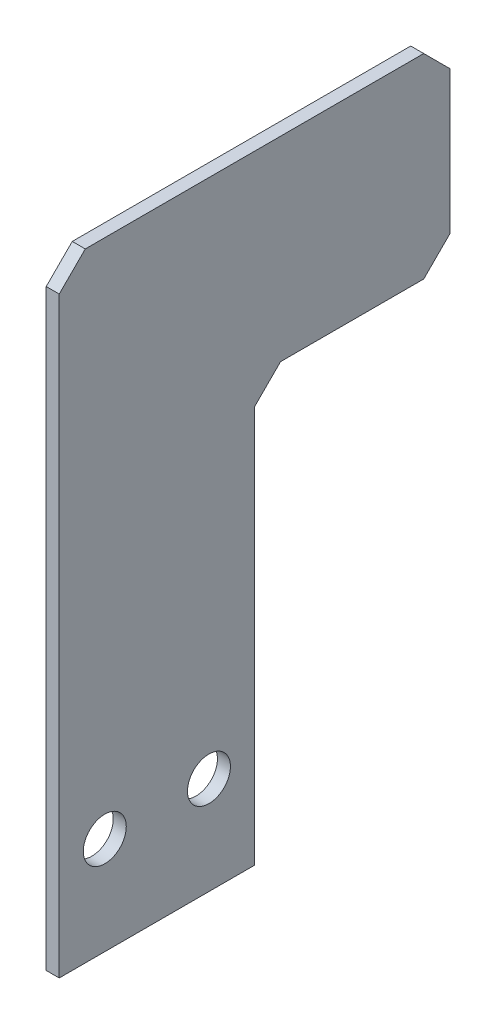
ISO-10303-21;
HEADER;
FILE_DESCRIPTION(('STEP AP214'),'2;1');
FILE_NAME('part.step','',(''),(''),'','','');
FILE_SCHEMA(('AUTOMOTIVE_DESIGN { 1 0 10303 214 1 1 1 1 }'));
ENDSEC;
DATA;
#1=APPLICATION_CONTEXT('core data for automotive mechanical design processes');
#2=APPLICATION_PROTOCOL_DEFINITION('international standard','automotive_design',2000,#1);
#3=PRODUCT_CONTEXT('',#1,'mechanical');
#4=PRODUCT('Part','Part','',(#3));
#5=PRODUCT_RELATED_PRODUCT_CATEGORY('part','',(#4));
#6=PRODUCT_DEFINITION_FORMATION('','',#4);
#7=PRODUCT_DEFINITION_CONTEXT('part definition',#1,'design');
#8=PRODUCT_DEFINITION('design','',#6,#7);
#9=PRODUCT_DEFINITION_SHAPE('','',#8);
#10=(LENGTH_UNIT() NAMED_UNIT(*) SI_UNIT(.MILLI.,.METRE.));
#11=(NAMED_UNIT(*) PLANE_ANGLE_UNIT() SI_UNIT($,.RADIAN.));
#12=(NAMED_UNIT(*) SI_UNIT($,.STERADIAN.) SOLID_ANGLE_UNIT());
#13=UNCERTAINTY_MEASURE_WITH_UNIT(LENGTH_MEASURE(1.E-05),#10,'distance_accuracy_value','');
#14=(GEOMETRIC_REPRESENTATION_CONTEXT(3) GLOBAL_UNCERTAINTY_ASSIGNED_CONTEXT((#13)) GLOBAL_UNIT_ASSIGNED_CONTEXT((#10,
#11,#12)) REPRESENTATION_CONTEXT('',''));
#15=CARTESIAN_POINT('',(0.,0.,0.));
#16=DIRECTION('',(0.,0.,1.));
#17=DIRECTION('',(1.,0.,0.));
#18=AXIS2_PLACEMENT_3D('',#15,#16,#17);
#19=CARTESIAN_POINT('',(2.54,34.3051190476191,-15.9505952380952));
#20=DIRECTION('',(0.,0.,1.));
#21=DIRECTION('',(0.,-1.,0.));
#22=AXIS2_PLACEMENT_3D('',#19,#20,#21);
#23=PLANE('',#22);
#24=DIRECTION('',(0.,1.,0.));
#25=VECTOR('',#24,1.);
#26=CARTESIAN_POINT('',(0.,34.3051190476191,-15.9505952380952));
#27=LINE('',#26,#25);
#28=CARTESIAN_POINT('',(0.,-43.1648809523809,-15.9505952380952));
#29=VERTEX_POINT('',#28);
#30=CARTESIAN_POINT('',(0.,34.3051190476191,-15.9505952380952));
#31=VERTEX_POINT('',#30);
#32=EDGE_CURVE('E140',#29,#31,#27,.T.);
#33=ORIENTED_EDGE('',*,*,#32,.T.);
#34=DIRECTION('',(-1.,0.,0.));
#35=VECTOR('',#34,1.);
#36=CARTESIAN_POINT('',(2.54,34.3051190476191,-15.9505952380952));
#37=LINE('',#36,#35);
#38=CARTESIAN_POINT('',(2.54,34.3051190476191,-15.9505952380952));
#39=VERTEX_POINT('',#38);
#40=EDGE_CURVE('E11',#39,#31,#37,.T.);
#41=ORIENTED_EDGE('',*,*,#40,.F.);
#42=DIRECTION('',(0.,1.,0.));
#43=VECTOR('',#42,1.);
#44=CARTESIAN_POINT('',(2.54,34.3051190476191,-15.9505952380952));
#45=LINE('',#44,#43);
#46=CARTESIAN_POINT('',(2.54,-43.1648809523809,-15.9505952380952));
#47=VERTEX_POINT('',#46);
#48=EDGE_CURVE('E159',#47,#39,#45,.T.);
#49=ORIENTED_EDGE('',*,*,#48,.F.);
#50=DIRECTION('',(-1.,0.,0.));
#51=VECTOR('',#50,1.);
#52=CARTESIAN_POINT('',(2.54,-43.1648809523809,-15.9505952380952));
#53=LINE('',#52,#51);
#54=EDGE_CURVE('E136',#47,#29,#53,.T.);
#55=ORIENTED_EDGE('',*,*,#54,.T.);
#56=EDGE_LOOP('',(#33,#41,#49,#55));
#57=FACE_BOUND('',#56,.T.);
#58=ADVANCED_FACE('F32',(#57),#23,.F.);
#59=CARTESIAN_POINT('',(2.54,34.3051190476191,-15.9505952380952));
#60=DIRECTION('',(0.,0.707106781186548,0.707106781186548));
#61=DIRECTION('',(0.,-0.707106781186548,0.707106781186548));
#62=AXIS2_PLACEMENT_3D('',#59,#60,#61);
#63=PLANE('',#62);
#64=DIRECTION('',(0.,0.707106781186548,-0.707106781186548));
#65=VECTOR('',#64,1.);
#66=CARTESIAN_POINT('',(0.,34.3051190476191,-15.9505952380952));
#67=LINE('',#66,#65);
#68=CARTESIAN_POINT('',(0.,39.3851190476191,-21.0305952380952));
#69=VERTEX_POINT('',#68);
#70=EDGE_CURVE('E143',#31,#69,#67,.T.);
#71=ORIENTED_EDGE('',*,*,#70,.T.);
#72=DIRECTION('',(-1.,0.,0.));
#73=VECTOR('',#72,1.);
#74=CARTESIAN_POINT('',(2.54,39.3851190476191,-21.0305952380952));
#75=LINE('',#74,#73);
#76=CARTESIAN_POINT('',(2.54,39.3851190476191,-21.0305952380952));
#77=VERTEX_POINT('',#76);
#78=EDGE_CURVE('E40',#77,#69,#75,.T.);
#79=ORIENTED_EDGE('',*,*,#78,.F.);
#80=DIRECTION('',(0.,0.707106781186548,-0.707106781186548));
#81=VECTOR('',#80,1.);
#82=CARTESIAN_POINT('',(2.54,34.3051190476191,-15.9505952380952));
#83=LINE('',#82,#81);
#84=EDGE_CURVE('E97',#39,#77,#83,.T.);
#85=ORIENTED_EDGE('',*,*,#84,.F.);
#86=ORIENTED_EDGE('',*,*,#40,.T.);
#87=EDGE_LOOP('',(#71,#79,#85,#86));
#88=FACE_BOUND('',#87,.T.);
#89=ADVANCED_FACE('F242',(#88),#63,.F.);
#90=CARTESIAN_POINT('',(2.54,39.3851190476191,-21.0305952380952));
#91=DIRECTION('',(0.,1.,0.));
#92=DIRECTION('',(0.,0.,1.));
#93=AXIS2_PLACEMENT_3D('',#90,#91,#92);
#94=PLANE('',#93);
#95=DIRECTION('',(0.,0.,-1.));
#96=VECTOR('',#95,1.);
#97=CARTESIAN_POINT('',(0.,39.3851190476191,-21.0305952380952));
#98=LINE('',#97,#96);
#99=CARTESIAN_POINT('',(0.,39.3851190476191,-48.9705952380952));
#100=VERTEX_POINT('',#99);
#101=EDGE_CURVE('E146',#69,#100,#98,.T.);
#102=ORIENTED_EDGE('',*,*,#101,.T.);
#103=DIRECTION('',(-1.,0.,0.));
#104=VECTOR('',#103,1.);
#105=CARTESIAN_POINT('',(2.54,39.3851190476191,-48.9705952380952));
#106=LINE('',#105,#104);
#107=CARTESIAN_POINT('',(2.54,39.3851190476191,-48.9705952380952));
#108=VERTEX_POINT('',#107);
#109=EDGE_CURVE('E172',#108,#100,#106,.T.);
#110=ORIENTED_EDGE('',*,*,#109,.F.);
#111=DIRECTION('',(0.,0.,-1.));
#112=VECTOR('',#111,1.);
#113=CARTESIAN_POINT('',(2.54,39.3851190476191,-21.0305952380952));
#114=LINE('',#113,#112);
#115=EDGE_CURVE('E180',#77,#108,#114,.T.);
#116=ORIENTED_EDGE('',*,*,#115,.F.);
#117=ORIENTED_EDGE('',*,*,#78,.T.);
#118=EDGE_LOOP('',(#102,#110,#116,#117));
#119=FACE_BOUND('',#118,.T.);
#120=ADVANCED_FACE('F178',(#119),#94,.F.);
#121=CARTESIAN_POINT('',(2.54,39.3851190476191,-48.9705952380952));
#122=DIRECTION('',(0.,0.707106781186548,0.707106781186547));
#123=DIRECTION('',(0.,-0.707106781186547,0.707106781186548));
#124=AXIS2_PLACEMENT_3D('',#121,#122,#123);
#125=PLANE('',#124);
#126=DIRECTION('',(0.,0.707106781186547,-0.707106781186548));
#127=VECTOR('',#126,1.);
#128=CARTESIAN_POINT('',(0.,39.3851190476191,-48.9705952380952));
#129=LINE('',#128,#127);
#130=CARTESIAN_POINT('',(0.,44.4651190476191,-54.0505952380952));
#131=VERTEX_POINT('',#130);
#132=EDGE_CURVE('E148',#100,#131,#129,.T.);
#133=ORIENTED_EDGE('',*,*,#132,.T.);
#134=DIRECTION('',(-1.,0.,0.));
#135=VECTOR('',#134,1.);
#136=CARTESIAN_POINT('',(2.54,44.4651190476191,-54.0505952380952));
#137=LINE('',#136,#135);
#138=CARTESIAN_POINT('',(2.54,44.4651190476191,-54.0505952380952));
#139=VERTEX_POINT('',#138);
#140=EDGE_CURVE('E169',#139,#131,#137,.T.);
#141=ORIENTED_EDGE('',*,*,#140,.F.);
#142=DIRECTION('',(0.,0.707106781186547,-0.707106781186548));
#143=VECTOR('',#142,1.);
#144=CARTESIAN_POINT('',(2.54,39.3851190476191,-48.9705952380952));
#145=LINE('',#144,#143);
#146=EDGE_CURVE('E198',#108,#139,#145,.T.);
#147=ORIENTED_EDGE('',*,*,#146,.F.);
#148=ORIENTED_EDGE('',*,*,#109,.T.);
#149=EDGE_LOOP('',(#133,#141,#147,#148));
#150=FACE_BOUND('',#149,.T.);
#151=ADVANCED_FACE('F189',(#150),#125,.F.);
#152=CARTESIAN_POINT('',(2.54,72.4051190476191,-54.0505952380952));
#153=DIRECTION('',(0.,0.,1.));
#154=DIRECTION('',(0.,-1.,0.));
#155=AXIS2_PLACEMENT_3D('',#152,#153,#154);
#156=PLANE('',#155);
#157=DIRECTION('',(0.,1.,0.));
#158=VECTOR('',#157,1.);
#159=CARTESIAN_POINT('',(0.,72.4051190476191,-54.0505952380952));
#160=LINE('',#159,#158);
#161=CARTESIAN_POINT('',(0.,72.4051190476191,-54.0505952380952));
#162=VERTEX_POINT('',#161);
#163=EDGE_CURVE('E150',#131,#162,#160,.T.);
#164=ORIENTED_EDGE('',*,*,#163,.T.);
#165=DIRECTION('',(-1.,0.,0.));
#166=VECTOR('',#165,1.);
#167=CARTESIAN_POINT('',(2.54,72.4051190476191,-54.0505952380952));
#168=LINE('',#167,#166);
#169=CARTESIAN_POINT('',(2.54,72.4051190476191,-54.0505952380952));
#170=VERTEX_POINT('',#169);
#171=EDGE_CURVE('E166',#170,#162,#168,.T.);
#172=ORIENTED_EDGE('',*,*,#171,.F.);
#173=DIRECTION('',(0.,1.,0.));
#174=VECTOR('',#173,1.);
#175=CARTESIAN_POINT('',(2.54,72.4051190476191,-54.0505952380952));
#176=LINE('',#175,#174);
#177=EDGE_CURVE('E195',#139,#170,#176,.T.);
#178=ORIENTED_EDGE('',*,*,#177,.F.);
#179=ORIENTED_EDGE('',*,*,#140,.T.);
#180=EDGE_LOOP('',(#164,#172,#178,#179));
#181=FACE_BOUND('',#180,.T.);
#182=ADVANCED_FACE('F193',(#181),#156,.F.);
#183=CARTESIAN_POINT('',(2.54,77.4851190476191,-48.9705952380952));
#184=DIRECTION('',(0.,-0.707106781186548,0.707106781186548));
#185=DIRECTION('',(0.,-0.707106781186548,-0.707106781186548));
#186=AXIS2_PLACEMENT_3D('',#183,#184,#185);
#187=PLANE('',#186);
#188=DIRECTION('',(0.,0.707106781186548,0.707106781186548));
#189=VECTOR('',#188,1.);
#190=CARTESIAN_POINT('',(0.,77.4851190476191,-48.9705952380952));
#191=LINE('',#190,#189);
#192=CARTESIAN_POINT('',(0.,77.4851190476191,-48.9705952380952));
#193=VERTEX_POINT('',#192);
#194=EDGE_CURVE('E152',#162,#193,#191,.T.);
#195=ORIENTED_EDGE('',*,*,#194,.T.);
#196=DIRECTION('',(-1.,0.,0.));
#197=VECTOR('',#196,1.);
#198=CARTESIAN_POINT('',(2.54,77.4851190476191,-48.9705952380952));
#199=LINE('',#198,#197);
#200=CARTESIAN_POINT('',(2.54,77.4851190476191,-48.9705952380952));
#201=VERTEX_POINT('',#200);
#202=EDGE_CURVE('E163',#201,#193,#199,.T.);
#203=ORIENTED_EDGE('',*,*,#202,.F.);
#204=DIRECTION('',(0.,0.707106781186548,0.707106781186548));
#205=VECTOR('',#204,1.);
#206=CARTESIAN_POINT('',(2.54,77.4851190476191,-48.9705952380952));
#207=LINE('',#206,#205);
#208=EDGE_CURVE('E197',#170,#201,#207,.T.);
#209=ORIENTED_EDGE('',*,*,#208,.F.);
#210=ORIENTED_EDGE('',*,*,#171,.T.);
#211=EDGE_LOOP('',(#195,#203,#209,#210));
#212=FACE_BOUND('',#211,.T.);
#213=ADVANCED_FACE('F254',(#212),#187,.F.);
#214=CARTESIAN_POINT('',(2.54,77.4851190476191,17.0694047619048));
#215=DIRECTION('',(0.,-1.,0.));
#216=DIRECTION('',(0.,0.,-1.));
#217=AXIS2_PLACEMENT_3D('',#214,#215,#216);
#218=PLANE('',#217);
#219=DIRECTION('',(0.,0.,1.));
#220=VECTOR('',#219,1.);
#221=CARTESIAN_POINT('',(0.,77.4851190476191,17.0694047619048));
#222=LINE('',#221,#220);
#223=CARTESIAN_POINT('',(0.,77.4851190476191,17.0694047619048));
#224=VERTEX_POINT('',#223);
#225=EDGE_CURVE('E154',#193,#224,#222,.T.);
#226=ORIENTED_EDGE('',*,*,#225,.T.);
#227=DIRECTION('',(-1.,0.,0.));
#228=VECTOR('',#227,1.);
#229=CARTESIAN_POINT('',(2.54,77.4851190476191,17.0694047619048));
#230=LINE('',#229,#228);
#231=CARTESIAN_POINT('',(2.54,77.4851190476191,17.0694047619048));
#232=VERTEX_POINT('',#231);
#233=EDGE_CURVE('E131',#232,#224,#230,.T.);
#234=ORIENTED_EDGE('',*,*,#233,.F.);
#235=DIRECTION('',(0.,0.,1.));
#236=VECTOR('',#235,1.);
#237=CARTESIAN_POINT('',(2.54,77.4851190476191,17.0694047619048));
#238=LINE('',#237,#236);
#239=EDGE_CURVE('E122',#201,#232,#238,.T.);
#240=ORIENTED_EDGE('',*,*,#239,.F.);
#241=ORIENTED_EDGE('',*,*,#202,.T.);
#242=EDGE_LOOP('',(#226,#234,#240,#241));
#243=FACE_BOUND('',#242,.T.);
#244=ADVANCED_FACE('F251',(#243),#218,.F.);
#245=CARTESIAN_POINT('',(2.54,72.4051190476191,22.1494047619048));
#246=DIRECTION('',(0.,-0.707106781186548,-0.707106781186548));
#247=DIRECTION('',(0.,0.707106781186548,-0.707106781186548));
#248=AXIS2_PLACEMENT_3D('',#245,#246,#247);
#249=PLANE('',#248);
#250=DIRECTION('',(0.,-0.707106781186548,0.707106781186548));
#251=VECTOR('',#250,1.);
#252=CARTESIAN_POINT('',(0.,72.4051190476191,22.1494047619048));
#253=LINE('',#252,#251);
#254=CARTESIAN_POINT('',(0.,72.4051190476191,22.1494047619048));
#255=VERTEX_POINT('',#254);
#256=EDGE_CURVE('E130',#224,#255,#253,.T.);
#257=ORIENTED_EDGE('',*,*,#256,.T.);
#258=DIRECTION('',(-1.,0.,0.));
#259=VECTOR('',#258,1.);
#260=CARTESIAN_POINT('',(2.54,72.4051190476191,22.1494047619048));
#261=LINE('',#260,#259);
#262=CARTESIAN_POINT('',(2.54,72.4051190476191,22.1494047619048));
#263=VERTEX_POINT('',#262);
#264=EDGE_CURVE('E127',#263,#255,#261,.T.);
#265=ORIENTED_EDGE('',*,*,#264,.F.);
#266=DIRECTION('',(0.,-0.707106781186548,0.707106781186548));
#267=VECTOR('',#266,1.);
#268=CARTESIAN_POINT('',(2.54,72.4051190476191,22.1494047619048));
#269=LINE('',#268,#267);
#270=EDGE_CURVE('E116',#232,#263,#269,.T.);
#271=ORIENTED_EDGE('',*,*,#270,.F.);
#272=ORIENTED_EDGE('',*,*,#233,.T.);
#273=EDGE_LOOP('',(#257,#265,#271,#272));
#274=FACE_BOUND('',#273,.T.);
#275=ADVANCED_FACE('F128',(#274),#249,.F.);
#276=CARTESIAN_POINT('',(2.54,72.4051190476191,22.1494047619048));
#277=DIRECTION('',(0.,0.,-1.));
#278=DIRECTION('',(0.,1.,0.));
#279=AXIS2_PLACEMENT_3D('',#276,#277,#278);
#280=PLANE('',#279);
#281=DIRECTION('',(0.,-1.,0.));
#282=VECTOR('',#281,1.);
#283=CARTESIAN_POINT('',(0.,72.4051190476191,22.1494047619048));
#284=LINE('',#283,#282);
#285=CARTESIAN_POINT('',(0.,-43.1648809523809,22.1494047619048));
#286=VERTEX_POINT('',#285);
#287=EDGE_CURVE('E83',#255,#286,#284,.T.);
#288=ORIENTED_EDGE('',*,*,#287,.T.);
#289=DIRECTION('',(-1.,0.,0.));
#290=VECTOR('',#289,1.);
#291=CARTESIAN_POINT('',(2.54,-43.1648809523809,22.1494047619048));
#292=LINE('',#291,#290);
#293=CARTESIAN_POINT('',(2.54,-43.1648809523809,22.1494047619048));
#294=VERTEX_POINT('',#293);
#295=EDGE_CURVE('E132',#294,#286,#292,.T.);
#296=ORIENTED_EDGE('',*,*,#295,.F.);
#297=DIRECTION('',(0.,-1.,0.));
#298=VECTOR('',#297,1.);
#299=CARTESIAN_POINT('',(2.54,72.4051190476191,22.1494047619048));
#300=LINE('',#299,#298);
#301=EDGE_CURVE('E120',#263,#294,#300,.T.);
#302=ORIENTED_EDGE('',*,*,#301,.F.);
#303=ORIENTED_EDGE('',*,*,#264,.T.);
#304=EDGE_LOOP('',(#288,#296,#302,#303));
#305=FACE_BOUND('',#304,.T.);
#306=ADVANCED_FACE('F134',(#305),#280,.F.);
#307=CARTESIAN_POINT('',(2.54,-43.1648809523809,22.1494047619048));
#308=DIRECTION('',(0.,1.,0.));
#309=DIRECTION('',(0.,0.,1.));
#310=AXIS2_PLACEMENT_3D('',#307,#308,#309);
#311=PLANE('',#310);
#312=DIRECTION('',(0.,0.,-1.));
#313=VECTOR('',#312,1.);
#314=CARTESIAN_POINT('',(0.,-43.1648809523809,22.1494047619048));
#315=LINE('',#314,#313);
#316=EDGE_CURVE('E89',#286,#29,#315,.T.);
#317=ORIENTED_EDGE('',*,*,#316,.T.);
#318=ORIENTED_EDGE('',*,*,#54,.F.);
#319=DIRECTION('',(0.,0.,-1.));
#320=VECTOR('',#319,1.);
#321=CARTESIAN_POINT('',(2.54,-43.1648809523809,22.1494047619048));
#322=LINE('',#321,#320);
#323=EDGE_CURVE('E48',#294,#47,#322,.T.);
#324=ORIENTED_EDGE('',*,*,#323,.F.);
#325=ORIENTED_EDGE('',*,*,#295,.T.);
#326=EDGE_LOOP('',(#317,#318,#324,#325));
#327=FACE_BOUND('',#326,.T.);
#328=ADVANCED_FACE('F229',(#327),#311,.F.);
#329=CARTESIAN_POINT('',(2.54,0.,0.));
#330=DIRECTION('',(1.,0.,0.));
#331=DIRECTION('',(0.,0.,-1.));
#332=AXIS2_PLACEMENT_3D('',#329,#330,#331);
#333=PLANE('',#332);
#334=CARTESIAN_POINT('',(2.54,-24.1148809523809,-7.06059523809524));
#335=DIRECTION('',(1.,0.,0.));
#336=DIRECTION('',(0.,0.,-1.));
#337=AXIS2_PLACEMENT_3D('',#334,#335,#336);
#338=CIRCLE('',#337,4.191);
#339=CARTESIAN_POINT('',(2.54,-24.1148809523809,-11.2515952380952));
#340=VERTEX_POINT('',#339);
#341=EDGE_CURVE('E212',#340,#340,#338,.T.);
#342=ORIENTED_EDGE('',*,*,#341,.F.);
#343=EDGE_LOOP('',(#342));
#344=FACE_BOUND('',#343,.T.);
#345=CARTESIAN_POINT('',(2.54,-24.1148809523809,13.2594047619048));
#346=DIRECTION('',(1.,0.,0.));
#347=DIRECTION('',(0.,0.,-1.));
#348=AXIS2_PLACEMENT_3D('',#345,#346,#347);
#349=CIRCLE('',#348,4.191);
#350=CARTESIAN_POINT('',(2.54,-24.1148809523809,9.06840476190476));
#351=VERTEX_POINT('',#350);
#352=EDGE_CURVE('E206',#351,#351,#349,.T.);
#353=ORIENTED_EDGE('',*,*,#352,.F.);
#354=EDGE_LOOP('',(#353));
#355=FACE_BOUND('',#354,.T.);
#356=ORIENTED_EDGE('',*,*,#48,.T.);
#357=ORIENTED_EDGE('',*,*,#84,.T.);
#358=ORIENTED_EDGE('',*,*,#115,.T.);
#359=ORIENTED_EDGE('',*,*,#146,.T.);
#360=ORIENTED_EDGE('',*,*,#177,.T.);
#361=ORIENTED_EDGE('',*,*,#208,.T.);
#362=ORIENTED_EDGE('',*,*,#239,.T.);
#363=ORIENTED_EDGE('',*,*,#270,.T.);
#364=ORIENTED_EDGE('',*,*,#301,.T.);
#365=ORIENTED_EDGE('',*,*,#323,.T.);
#366=EDGE_LOOP('',(#356,#357,#358,#359,#360,#361,#362,#363,#364,#365));
#367=FACE_BOUND('',#366,.T.);
#368=ADVANCED_FACE('F118',(#344,#355,#367),#333,.T.);
#369=CARTESIAN_POINT('',(0.,0.,0.));
#370=DIRECTION('',(1.,0.,0.));
#371=DIRECTION('',(0.,0.,-1.));
#372=AXIS2_PLACEMENT_3D('',#369,#370,#371);
#373=PLANE('',#372);
#374=CARTESIAN_POINT('',(0.,-24.1148809523809,-7.06059523809524));
#375=DIRECTION('',(1.,0.,0.));
#376=DIRECTION('',(0.,0.,-1.));
#377=AXIS2_PLACEMENT_3D('',#374,#375,#376);
#378=CIRCLE('',#377,4.191);
#379=CARTESIAN_POINT('',(0.,-24.1148809523809,-11.2515952380952));
#380=VERTEX_POINT('',#379);
#381=EDGE_CURVE('E209',#380,#380,#378,.T.);
#382=ORIENTED_EDGE('',*,*,#381,.T.);
#383=EDGE_LOOP('',(#382));
#384=FACE_BOUND('',#383,.T.);
#385=CARTESIAN_POINT('',(0.,-24.1148809523809,13.2594047619048));
#386=DIRECTION('',(1.,0.,0.));
#387=DIRECTION('',(0.,0.,-1.));
#388=AXIS2_PLACEMENT_3D('',#385,#386,#387);
#389=CIRCLE('',#388,4.191);
#390=CARTESIAN_POINT('',(0.,-24.1148809523809,9.06840476190476));
#391=VERTEX_POINT('',#390);
#392=EDGE_CURVE('E144',#391,#391,#389,.T.);
#393=ORIENTED_EDGE('',*,*,#392,.T.);
#394=EDGE_LOOP('',(#393));
#395=FACE_BOUND('',#394,.T.);
#396=ORIENTED_EDGE('',*,*,#32,.F.);
#397=ORIENTED_EDGE('',*,*,#316,.F.);
#398=ORIENTED_EDGE('',*,*,#287,.F.);
#399=ORIENTED_EDGE('',*,*,#256,.F.);
#400=ORIENTED_EDGE('',*,*,#225,.F.);
#401=ORIENTED_EDGE('',*,*,#194,.F.);
#402=ORIENTED_EDGE('',*,*,#163,.F.);
#403=ORIENTED_EDGE('',*,*,#132,.F.);
#404=ORIENTED_EDGE('',*,*,#101,.F.);
#405=ORIENTED_EDGE('',*,*,#70,.F.);
#406=EDGE_LOOP('',(#396,#397,#398,#399,#400,#401,#402,#403,#404,#405));
#407=FACE_BOUND('',#406,.T.);
#408=ADVANCED_FACE('F184',(#384,#395,#407),#373,.F.);
#409=CARTESIAN_POINT('',(0.,-24.1148809523809,13.2594047619048));
#410=DIRECTION('',(1.,0.,0.));
#411=DIRECTION('',(0.,0.,-1.));
#412=AXIS2_PLACEMENT_3D('',#409,#410,#411);
#413=CYLINDRICAL_SURFACE('',#412,4.191);
#414=ORIENTED_EDGE('',*,*,#392,.F.);
#415=EDGE_LOOP('',(#414));
#416=FACE_BOUND('',#415,.T.);
#417=ORIENTED_EDGE('',*,*,#352,.T.);
#418=EDGE_LOOP('',(#417));
#419=FACE_BOUND('',#418,.T.);
#420=ADVANCED_FACE('F223',(#416,#419),#413,.F.);
#421=CARTESIAN_POINT('',(0.,-24.1148809523809,-7.06059523809524));
#422=DIRECTION('',(1.,0.,0.));
#423=DIRECTION('',(0.,0.,-1.));
#424=AXIS2_PLACEMENT_3D('',#421,#422,#423);
#425=CYLINDRICAL_SURFACE('',#424,4.191);
#426=ORIENTED_EDGE('',*,*,#381,.F.);
#427=EDGE_LOOP('',(#426));
#428=FACE_BOUND('',#427,.T.);
#429=ORIENTED_EDGE('',*,*,#341,.T.);
#430=EDGE_LOOP('',(#429));
#431=FACE_BOUND('',#430,.T.);
#432=ADVANCED_FACE('F220',(#428,#431),#425,.F.);
#433=CLOSED_SHELL('',(#58,#89,#120,#151,#182,#213,#244,#275,#306,#328,#368,#408,#420,#432));
#434=MANIFOLD_SOLID_BREP('B2',#433);
#435=ADVANCED_BREP_SHAPE_REPRESENTATION('',(#18,#434),#14);
#436=SHAPE_DEFINITION_REPRESENTATION(#9,#435);
ENDSEC;
END-ISO-10303-21;
